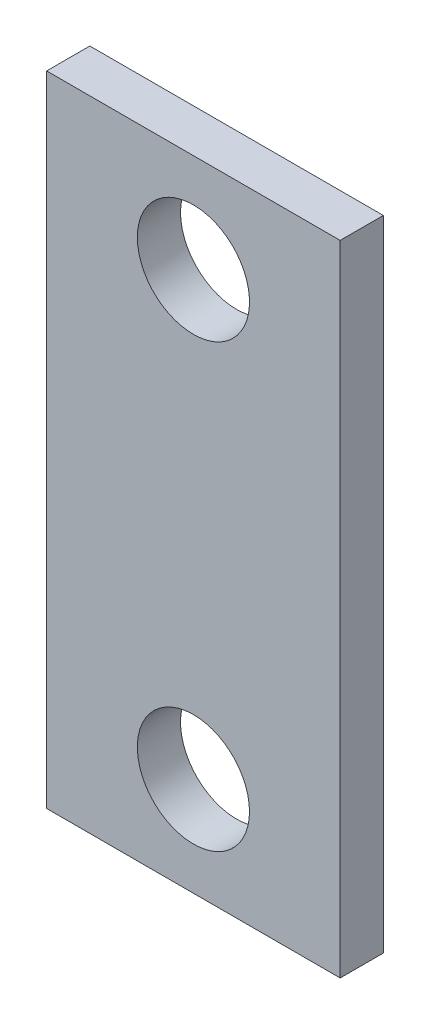
ISO-10303-21;
HEADER;
FILE_DESCRIPTION(('STEP AP214'),'2;1');
FILE_NAME('part.step','',(''),(''),'','','');
FILE_SCHEMA(('AUTOMOTIVE_DESIGN { 1 0 10303 214 1 1 1 1 }'));
ENDSEC;
DATA;
#1=APPLICATION_CONTEXT('core data for automotive mechanical design processes');
#2=APPLICATION_PROTOCOL_DEFINITION('international standard','automotive_design',2000,#1);
#3=PRODUCT_CONTEXT('',#1,'mechanical');
#4=PRODUCT('Part','Part','',(#3));
#5=PRODUCT_RELATED_PRODUCT_CATEGORY('part','',(#4));
#6=PRODUCT_DEFINITION_FORMATION('','',#4);
#7=PRODUCT_DEFINITION_CONTEXT('part definition',#1,'design');
#8=PRODUCT_DEFINITION('design','',#6,#7);
#9=PRODUCT_DEFINITION_SHAPE('','',#8);
#10=(LENGTH_UNIT() NAMED_UNIT(*) SI_UNIT(.MILLI.,.METRE.));
#11=(NAMED_UNIT(*) PLANE_ANGLE_UNIT() SI_UNIT($,.RADIAN.));
#12=(NAMED_UNIT(*) SI_UNIT($,.STERADIAN.) SOLID_ANGLE_UNIT());
#13=UNCERTAINTY_MEASURE_WITH_UNIT(LENGTH_MEASURE(1.E-05),#10,'distance_accuracy_value','');
#14=(GEOMETRIC_REPRESENTATION_CONTEXT(3) GLOBAL_UNCERTAINTY_ASSIGNED_CONTEXT((#13)) GLOBAL_UNIT_ASSIGNED_CONTEXT((#10,
#11,#12)) REPRESENTATION_CONTEXT('',''));
#15=CARTESIAN_POINT('',(0.,0.,0.));
#16=DIRECTION('',(0.,0.,1.));
#17=DIRECTION('',(1.,0.,0.));
#18=AXIS2_PLACEMENT_3D('',#15,#16,#17);
#19=CARTESIAN_POINT('',(0.,0.,3.175));
#20=DIRECTION('',(0.,0.,-1.));
#21=DIRECTION('',(-1.,0.,0.));
#22=AXIS2_PLACEMENT_3D('',#19,#20,#21);
#23=PLANE('',#22);
#24=CARTESIAN_POINT('',(10.795,39.7298015993552,3.175));
#25=DIRECTION('',(0.,0.,-1.));
#26=DIRECTION('',(-1.,0.,0.));
#27=AXIS2_PLACEMENT_3D('',#24,#25,#26);
#28=CIRCLE('',#27,4.124999878);
#29=CARTESIAN_POINT('',(6.670000122,39.7298015993552,3.175));
#30=VERTEX_POINT('',#29);
#31=EDGE_CURVE('E185',#30,#30,#28,.T.);
#32=ORIENTED_EDGE('',*,*,#31,.T.);
#33=EDGE_LOOP('',(#32));
#34=FACE_BOUND('',#33,.T.);
#35=DIRECTION('',(0.,1.,0.));
#36=VECTOR('',#35,1.);
#37=CARTESIAN_POINT('',(0.,0.,3.175));
#38=LINE('',#37,#36);
#39=CARTESIAN_POINT('',(0.,0.,3.175));
#40=VERTEX_POINT('',#39);
#41=CARTESIAN_POINT('',(0.,46.99,3.175));
#42=VERTEX_POINT('',#41);
#43=EDGE_CURVE('E132',#40,#42,#38,.T.);
#44=ORIENTED_EDGE('',*,*,#43,.F.);
#45=DIRECTION('',(1.,0.,0.));
#46=VECTOR('',#45,1.);
#47=CARTESIAN_POINT('',(0.,0.,3.175));
#48=LINE('',#47,#46);
#49=CARTESIAN_POINT('',(21.59,0.,3.175));
#50=VERTEX_POINT('',#49);
#51=EDGE_CURVE('E122',#40,#50,#48,.T.);
#52=ORIENTED_EDGE('',*,*,#51,.T.);
#53=DIRECTION('',(0.,1.,0.));
#54=VECTOR('',#53,1.);
#55=CARTESIAN_POINT('',(21.59,0.,3.175));
#56=LINE('',#55,#54);
#57=CARTESIAN_POINT('',(21.59,46.99,3.175));
#58=VERTEX_POINT('',#57);
#59=EDGE_CURVE('E117',#50,#58,#56,.T.);
#60=ORIENTED_EDGE('',*,*,#59,.T.);
#61=DIRECTION('',(1.,0.,0.));
#62=VECTOR('',#61,1.);
#63=CARTESIAN_POINT('',(0.,46.99,3.175));
#64=LINE('',#63,#62);
#65=EDGE_CURVE('E121',#42,#58,#64,.T.);
#66=ORIENTED_EDGE('',*,*,#65,.F.);
#67=EDGE_LOOP('',(#44,#52,#60,#66));
#68=FACE_BOUND('',#67,.T.);
#69=CARTESIAN_POINT('',(10.795,7.26019840064482,3.175));
#70=DIRECTION('',(0.,0.,1.));
#71=DIRECTION('',(1.,0.,0.));
#72=AXIS2_PLACEMENT_3D('',#69,#70,#71);
#73=CIRCLE('',#72,4.124999878);
#74=CARTESIAN_POINT('',(14.919999878,7.26019840064482,3.175));
#75=VERTEX_POINT('',#74);
#76=EDGE_CURVE('E142',#75,#75,#73,.T.);
#77=ORIENTED_EDGE('',*,*,#76,.F.);
#78=EDGE_LOOP('',(#77));
#79=FACE_BOUND('',#78,.T.);
#80=ADVANCED_FACE('F71',(#34,#68,#79),#23,.F.);
#81=CARTESIAN_POINT('',(0.,0.,0.));
#82=DIRECTION('',(0.,0.,-1.));
#83=DIRECTION('',(-1.,0.,0.));
#84=AXIS2_PLACEMENT_3D('',#81,#82,#83);
#85=PLANE('',#84);
#86=CARTESIAN_POINT('',(10.795,39.7298015993552,0.));
#87=DIRECTION('',(0.,0.,-1.));
#88=DIRECTION('',(-1.,0.,0.));
#89=AXIS2_PLACEMENT_3D('',#86,#87,#88);
#90=CIRCLE('',#89,4.124999878);
#91=CARTESIAN_POINT('',(6.670000122,39.7298015993552,0.));
#92=VERTEX_POINT('',#91);
#93=EDGE_CURVE('E187',#92,#92,#90,.T.);
#94=ORIENTED_EDGE('',*,*,#93,.F.);
#95=EDGE_LOOP('',(#94));
#96=FACE_BOUND('',#95,.T.);
#97=DIRECTION('',(0.,1.,0.));
#98=VECTOR('',#97,1.);
#99=CARTESIAN_POINT('',(0.,0.,0.));
#100=LINE('',#99,#98);
#101=CARTESIAN_POINT('',(0.,0.,0.));
#102=VERTEX_POINT('',#101);
#103=CARTESIAN_POINT('',(0.,46.99,0.));
#104=VERTEX_POINT('',#103);
#105=EDGE_CURVE('E138',#102,#104,#100,.T.);
#106=ORIENTED_EDGE('',*,*,#105,.T.);
#107=DIRECTION('',(1.,0.,0.));
#108=VECTOR('',#107,1.);
#109=CARTESIAN_POINT('',(0.,46.99,0.));
#110=LINE('',#109,#108);
#111=CARTESIAN_POINT('',(21.59,46.99,0.));
#112=VERTEX_POINT('',#111);
#113=EDGE_CURVE('E141',#104,#112,#110,.T.);
#114=ORIENTED_EDGE('',*,*,#113,.T.);
#115=DIRECTION('',(0.,1.,0.));
#116=VECTOR('',#115,1.);
#117=CARTESIAN_POINT('',(21.59,0.,0.));
#118=LINE('',#117,#116);
#119=CARTESIAN_POINT('',(21.59,0.,0.));
#120=VERTEX_POINT('',#119);
#121=EDGE_CURVE('E129',#120,#112,#118,.T.);
#122=ORIENTED_EDGE('',*,*,#121,.F.);
#123=DIRECTION('',(1.,0.,0.));
#124=VECTOR('',#123,1.);
#125=CARTESIAN_POINT('',(0.,0.,0.));
#126=LINE('',#125,#124);
#127=EDGE_CURVE('E105',#102,#120,#126,.T.);
#128=ORIENTED_EDGE('',*,*,#127,.F.);
#129=EDGE_LOOP('',(#106,#114,#122,#128));
#130=FACE_BOUND('',#129,.T.);
#131=CARTESIAN_POINT('',(10.795,7.26019840064482,0.));
#132=DIRECTION('',(0.,0.,1.));
#133=DIRECTION('',(1.,0.,0.));
#134=AXIS2_PLACEMENT_3D('',#131,#132,#133);
#135=CIRCLE('',#134,4.124999878);
#136=CARTESIAN_POINT('',(14.919999878,7.26019840064482,0.));
#137=VERTEX_POINT('',#136);
#138=EDGE_CURVE('E184',#137,#137,#135,.T.);
#139=ORIENTED_EDGE('',*,*,#138,.T.);
#140=EDGE_LOOP('',(#139));
#141=FACE_BOUND('',#140,.T.);
#142=ADVANCED_FACE('F147',(#96,#130,#141),#85,.T.);
#143=CARTESIAN_POINT('',(0.,0.,3.175));
#144=DIRECTION('',(-1.,0.,0.));
#145=DIRECTION('',(0.,0.,1.));
#146=AXIS2_PLACEMENT_3D('',#143,#144,#145);
#147=PLANE('',#146);
#148=ORIENTED_EDGE('',*,*,#105,.F.);
#149=DIRECTION('',(0.,0.,-1.));
#150=VECTOR('',#149,1.);
#151=CARTESIAN_POINT('',(0.,0.,3.175));
#152=LINE('',#151,#150);
#153=EDGE_CURVE('E12',#40,#102,#152,.T.);
#154=ORIENTED_EDGE('',*,*,#153,.F.);
#155=ORIENTED_EDGE('',*,*,#43,.T.);
#156=DIRECTION('',(0.,0.,-1.));
#157=VECTOR('',#156,1.);
#158=CARTESIAN_POINT('',(0.,46.99,3.175));
#159=LINE('',#158,#157);
#160=EDGE_CURVE('E75',#42,#104,#159,.T.);
#161=ORIENTED_EDGE('',*,*,#160,.T.);
#162=EDGE_LOOP('',(#148,#154,#155,#161));
#163=FACE_BOUND('',#162,.T.);
#164=ADVANCED_FACE('F73',(#163),#147,.T.);
#165=CARTESIAN_POINT('',(0.,0.,3.175));
#166=DIRECTION('',(0.,1.,0.));
#167=DIRECTION('',(0.,0.,1.));
#168=AXIS2_PLACEMENT_3D('',#165,#166,#167);
#169=PLANE('',#168);
#170=ORIENTED_EDGE('',*,*,#127,.T.);
#171=DIRECTION('',(0.,0.,-1.));
#172=VECTOR('',#171,1.);
#173=CARTESIAN_POINT('',(21.59,0.,3.175));
#174=LINE('',#173,#172);
#175=EDGE_CURVE('E81',#50,#120,#174,.T.);
#176=ORIENTED_EDGE('',*,*,#175,.F.);
#177=ORIENTED_EDGE('',*,*,#51,.F.);
#178=ORIENTED_EDGE('',*,*,#153,.T.);
#179=EDGE_LOOP('',(#170,#176,#177,#178));
#180=FACE_BOUND('',#179,.T.);
#181=ADVANCED_FACE('F150',(#180),#169,.F.);
#182=CARTESIAN_POINT('',(21.59,0.,3.175));
#183=DIRECTION('',(-1.,0.,0.));
#184=DIRECTION('',(0.,0.,1.));
#185=AXIS2_PLACEMENT_3D('',#182,#183,#184);
#186=PLANE('',#185);
#187=ORIENTED_EDGE('',*,*,#121,.T.);
#188=DIRECTION('',(0.,0.,-1.));
#189=VECTOR('',#188,1.);
#190=CARTESIAN_POINT('',(21.59,46.99,3.175));
#191=LINE('',#190,#189);
#192=EDGE_CURVE('E126',#58,#112,#191,.T.);
#193=ORIENTED_EDGE('',*,*,#192,.F.);
#194=ORIENTED_EDGE('',*,*,#59,.F.);
#195=ORIENTED_EDGE('',*,*,#175,.T.);
#196=EDGE_LOOP('',(#187,#193,#194,#195));
#197=FACE_BOUND('',#196,.T.);
#198=ADVANCED_FACE('F127',(#197),#186,.F.);
#199=CARTESIAN_POINT('',(0.,46.99,3.175));
#200=DIRECTION('',(0.,1.,0.));
#201=DIRECTION('',(0.,0.,1.));
#202=AXIS2_PLACEMENT_3D('',#199,#200,#201);
#203=PLANE('',#202);
#204=ORIENTED_EDGE('',*,*,#113,.F.);
#205=ORIENTED_EDGE('',*,*,#160,.F.);
#206=ORIENTED_EDGE('',*,*,#65,.T.);
#207=ORIENTED_EDGE('',*,*,#192,.T.);
#208=EDGE_LOOP('',(#204,#205,#206,#207));
#209=FACE_BOUND('',#208,.T.);
#210=ADVANCED_FACE('F131',(#209),#203,.T.);
#211=CARTESIAN_POINT('',(10.795,7.26019840064482,3.175));
#212=DIRECTION('',(0.,0.,-1.));
#213=DIRECTION('',(-1.,0.,0.));
#214=AXIS2_PLACEMENT_3D('',#211,#212,#213);
#215=CYLINDRICAL_SURFACE('',#214,4.124999878);
#216=ORIENTED_EDGE('',*,*,#76,.T.);
#217=EDGE_LOOP('',(#216));
#218=FACE_BOUND('',#217,.T.);
#219=ORIENTED_EDGE('',*,*,#138,.F.);
#220=EDGE_LOOP('',(#219));
#221=FACE_BOUND('',#220,.T.);
#222=ADVANCED_FACE('F165',(#218,#221),#215,.F.);
#223=CARTESIAN_POINT('',(10.795,39.7298015993552,3.175));
#224=DIRECTION('',(0.,0.,-1.));
#225=DIRECTION('',(-1.,0.,0.));
#226=AXIS2_PLACEMENT_3D('',#223,#224,#225);
#227=CYLINDRICAL_SURFACE('',#226,4.124999878);
#228=ORIENTED_EDGE('',*,*,#31,.F.);
#229=EDGE_LOOP('',(#228));
#230=FACE_BOUND('',#229,.T.);
#231=ORIENTED_EDGE('',*,*,#93,.T.);
#232=EDGE_LOOP('',(#231));
#233=FACE_BOUND('',#232,.T.);
#234=ADVANCED_FACE('F173',(#230,#233),#227,.F.);
#235=CLOSED_SHELL('',(#80,#142,#164,#181,#198,#210,#222,#234));
#236=MANIFOLD_SOLID_BREP('B2',#235);
#237=ADVANCED_BREP_SHAPE_REPRESENTATION('',(#18,#236),#14);
#238=SHAPE_DEFINITION_REPRESENTATION(#9,#237);
ENDSEC;
END-ISO-10303-21;
